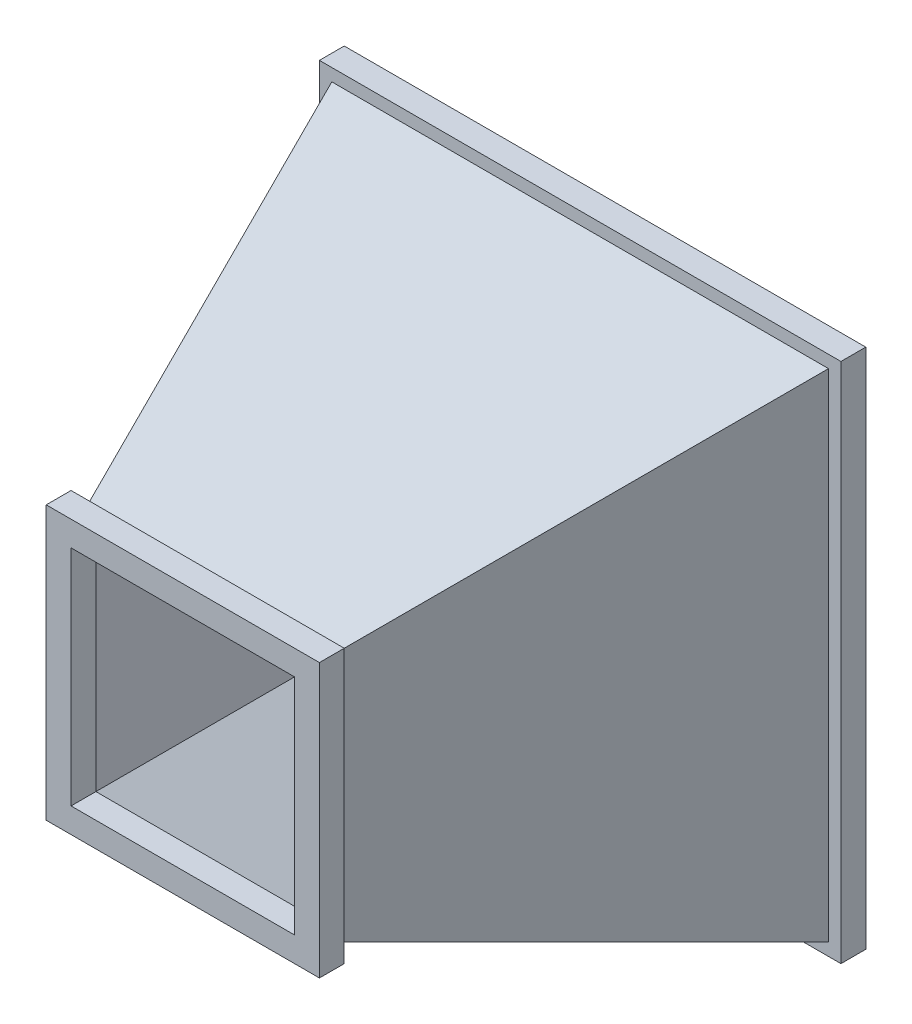
ISO-10303-21;
HEADER;
FILE_DESCRIPTION(('STEP AP214'),'2;1');
FILE_NAME('part.step','',(''),(''),'','','');
FILE_SCHEMA(('AUTOMOTIVE_DESIGN { 1 0 10303 214 1 1 1 1 }'));
ENDSEC;
DATA;
#1=APPLICATION_CONTEXT('core data for automotive mechanical design processes');
#2=APPLICATION_PROTOCOL_DEFINITION('international standard','automotive_design',2000,#1);
#3=PRODUCT_CONTEXT('',#1,'mechanical');
#4=PRODUCT('Part','Part','',(#3));
#5=PRODUCT_RELATED_PRODUCT_CATEGORY('part','',(#4));
#6=PRODUCT_DEFINITION_FORMATION('','',#4);
#7=PRODUCT_DEFINITION_CONTEXT('part definition',#1,'design');
#8=PRODUCT_DEFINITION('design','',#6,#7);
#9=PRODUCT_DEFINITION_SHAPE('','',#8);
#10=(LENGTH_UNIT() NAMED_UNIT(*) SI_UNIT(.MILLI.,.METRE.));
#11=(NAMED_UNIT(*) PLANE_ANGLE_UNIT() SI_UNIT($,.RADIAN.));
#12=(NAMED_UNIT(*) SI_UNIT($,.STERADIAN.) SOLID_ANGLE_UNIT());
#13=UNCERTAINTY_MEASURE_WITH_UNIT(LENGTH_MEASURE(1.E-05),#10,'distance_accuracy_value','');
#14=(GEOMETRIC_REPRESENTATION_CONTEXT(3) GLOBAL_UNCERTAINTY_ASSIGNED_CONTEXT((#13)) GLOBAL_UNIT_ASSIGNED_CONTEXT((#10,
#11,#12)) REPRESENTATION_CONTEXT('',''));
#15=CARTESIAN_POINT('',(0.,0.,0.));
#16=DIRECTION('',(0.,0.,1.));
#17=DIRECTION('',(1.,0.,0.));
#18=AXIS2_PLACEMENT_3D('',#15,#16,#17);
#19=CARTESIAN_POINT('',(228.6,0.,76.1999999999999));
#20=DIRECTION('',(0.948683298050514,0.,0.316227766016838));
#21=DIRECTION('',(0.316227766016838,0.,-0.948683298050514));
#22=AXIS2_PLACEMENT_3D('',#19,#20,#21);
#23=PLANE('',#22);
#24=DIRECTION('',(0.301511344577764,-0.301511344577764,-0.904534033733291));
#25=VECTOR('',#24,1.);
#26=CARTESIAN_POINT('',(127.,-127.,381.));
#27=LINE('',#26,#25);
#28=CARTESIAN_POINT('',(127.,-127.,381.));
#29=VERTEX_POINT('',#28);
#30=CARTESIAN_POINT('',(254.,-254.,0.));
#31=VERTEX_POINT('',#30);
#32=EDGE_CURVE('E364',#29,#31,#27,.T.);
#33=ORIENTED_EDGE('',*,*,#32,.T.);
#34=DIRECTION('',(0.,1.,0.));
#35=VECTOR('',#34,1.);
#36=CARTESIAN_POINT('',(254.,-254.,0.));
#37=LINE('',#36,#35);
#38=CARTESIAN_POINT('',(254.,254.,0.));
#39=VERTEX_POINT('',#38);
#40=EDGE_CURVE('E374',#31,#39,#37,.T.);
#41=ORIENTED_EDGE('',*,*,#40,.T.);
#42=DIRECTION('',(0.301511344577764,0.301511344577764,-0.904534033733291));
#43=VECTOR('',#42,1.);
#44=CARTESIAN_POINT('',(127.,127.,381.));
#45=LINE('',#44,#43);
#46=CARTESIAN_POINT('',(127.,127.,381.));
#47=VERTEX_POINT('',#46);
#48=EDGE_CURVE('E361',#47,#39,#45,.T.);
#49=ORIENTED_EDGE('',*,*,#48,.F.);
#50=DIRECTION('',(0.,1.,0.));
#51=VECTOR('',#50,1.);
#52=CARTESIAN_POINT('',(127.,-127.,381.));
#53=LINE('',#52,#51);
#54=EDGE_CURVE('E391',#29,#47,#53,.T.);
#55=ORIENTED_EDGE('',*,*,#54,.F.);
#56=EDGE_LOOP('',(#33,#41,#49,#55));
#57=FACE_BOUND('',#56,.T.);
#58=ADVANCED_FACE('F57',(#57),#23,.T.);
#59=CARTESIAN_POINT('',(0.,228.6,76.1999999999999));
#60=DIRECTION('',(0.,0.948683298050514,0.316227766016838));
#61=DIRECTION('',(0.,-0.316227766016838,0.948683298050514));
#62=AXIS2_PLACEMENT_3D('',#59,#60,#61);
#63=PLANE('',#62);
#64=ORIENTED_EDGE('',*,*,#48,.T.);
#65=DIRECTION('',(-1.,0.,0.));
#66=VECTOR('',#65,1.);
#67=CARTESIAN_POINT('',(-254.,254.,0.));
#68=LINE('',#67,#66);
#69=CARTESIAN_POINT('',(-254.,254.,0.));
#70=VERTEX_POINT('',#69);
#71=EDGE_CURVE('E481',#39,#70,#68,.T.);
#72=ORIENTED_EDGE('',*,*,#71,.T.);
#73=DIRECTION('',(-0.301511344577764,0.301511344577764,-0.904534033733291));
#74=VECTOR('',#73,1.);
#75=CARTESIAN_POINT('',(-127.,127.,381.));
#76=LINE('',#75,#74);
#77=CARTESIAN_POINT('',(-127.,127.,381.));
#78=VERTEX_POINT('',#77);
#79=EDGE_CURVE('E360',#78,#70,#76,.T.);
#80=ORIENTED_EDGE('',*,*,#79,.F.);
#81=DIRECTION('',(-1.,0.,0.));
#82=VECTOR('',#81,1.);
#83=CARTESIAN_POINT('',(-127.,127.,381.));
#84=LINE('',#83,#82);
#85=EDGE_CURVE('E453',#47,#78,#84,.T.);
#86=ORIENTED_EDGE('',*,*,#85,.F.);
#87=EDGE_LOOP('',(#64,#72,#80,#86));
#88=FACE_BOUND('',#87,.T.);
#89=ADVANCED_FACE('F497',(#88),#63,.T.);
#90=CARTESIAN_POINT('',(0.,-228.6,76.2));
#91=DIRECTION('',(0.,-0.948683298050514,0.316227766016838));
#92=DIRECTION('',(0.,-0.316227766016838,-0.948683298050514));
#93=AXIS2_PLACEMENT_3D('',#90,#91,#92);
#94=PLANE('',#93);
#95=DIRECTION('',(-0.301511344577764,-0.301511344577764,-0.904534033733291));
#96=VECTOR('',#95,1.);
#97=CARTESIAN_POINT('',(-127.,-127.,381.));
#98=LINE('',#97,#96);
#99=CARTESIAN_POINT('',(-127.,-127.,381.));
#100=VERTEX_POINT('',#99);
#101=CARTESIAN_POINT('',(-254.,-254.,0.));
#102=VERTEX_POINT('',#101);
#103=EDGE_CURVE('E356',#100,#102,#98,.T.);
#104=ORIENTED_EDGE('',*,*,#103,.T.);
#105=DIRECTION('',(1.,0.,0.));
#106=VECTOR('',#105,1.);
#107=CARTESIAN_POINT('',(-254.,-254.,0.));
#108=LINE('',#107,#106);
#109=EDGE_CURVE('E12',#102,#31,#108,.T.);
#110=ORIENTED_EDGE('',*,*,#109,.T.);
#111=ORIENTED_EDGE('',*,*,#32,.F.);
#112=DIRECTION('',(1.,0.,0.));
#113=VECTOR('',#112,1.);
#114=CARTESIAN_POINT('',(-127.,-127.,381.));
#115=LINE('',#114,#113);
#116=EDGE_CURVE('E368',#100,#29,#115,.T.);
#117=ORIENTED_EDGE('',*,*,#116,.F.);
#118=EDGE_LOOP('',(#104,#110,#111,#117));
#119=FACE_BOUND('',#118,.T.);
#120=ADVANCED_FACE('F503',(#119),#94,.T.);
#121=CARTESIAN_POINT('',(-228.6,0.,76.2));
#122=DIRECTION('',(-0.948683298050514,0.,0.316227766016838));
#123=DIRECTION('',(0.316227766016838,0.,0.948683298050514));
#124=AXIS2_PLACEMENT_3D('',#121,#122,#123);
#125=PLANE('',#124);
#126=ORIENTED_EDGE('',*,*,#79,.T.);
#127=DIRECTION('',(0.,-1.,0.));
#128=VECTOR('',#127,1.);
#129=CARTESIAN_POINT('',(-254.,-254.,0.));
#130=LINE('',#129,#128);
#131=EDGE_CURVE('E67',#70,#102,#130,.T.);
#132=ORIENTED_EDGE('',*,*,#131,.T.);
#133=ORIENTED_EDGE('',*,*,#103,.F.);
#134=DIRECTION('',(0.,-1.,0.));
#135=VECTOR('',#134,1.);
#136=CARTESIAN_POINT('',(-127.,-127.,381.));
#137=LINE('',#136,#135);
#138=EDGE_CURVE('E447',#78,#100,#137,.T.);
#139=ORIENTED_EDGE('',*,*,#138,.F.);
#140=EDGE_LOOP('',(#126,#132,#133,#139));
#141=FACE_BOUND('',#140,.T.);
#142=ADVANCED_FACE('F59',(#141),#125,.T.);
#143=CARTESIAN_POINT('',(0.,217.17,72.39));
#144=DIRECTION('',(0.,-0.948683298050514,-0.316227766016838));
#145=DIRECTION('',(0.,0.316227766016838,-0.948683298050514));
#146=AXIS2_PLACEMENT_3D('',#143,#144,#145);
#147=PLANE('',#146);
#148=DIRECTION('',(0.301511344577764,-0.301511344577764,0.904534033733291));
#149=VECTOR('',#148,1.);
#150=CARTESIAN_POINT('',(-241.3,241.3,0.));
#151=LINE('',#150,#149);
#152=CARTESIAN_POINT('',(-241.3,241.3,0.));
#153=VERTEX_POINT('',#152);
#154=CARTESIAN_POINT('',(-114.3,114.3,381.));
#155=VERTEX_POINT('',#154);
#156=EDGE_CURVE('E336',#153,#155,#151,.T.);
#157=ORIENTED_EDGE('',*,*,#156,.F.);
#158=DIRECTION('',(1.,0.,0.));
#159=VECTOR('',#158,1.);
#160=CARTESIAN_POINT('',(-241.3,241.3,0.));
#161=LINE('',#160,#159);
#162=CARTESIAN_POINT('',(241.3,241.3,0.));
#163=VERTEX_POINT('',#162);
#164=EDGE_CURVE('E215',#153,#163,#161,.T.);
#165=ORIENTED_EDGE('',*,*,#164,.T.);
#166=DIRECTION('',(-0.301511344577764,-0.301511344577764,0.904534033733291));
#167=VECTOR('',#166,1.);
#168=CARTESIAN_POINT('',(241.3,241.3,0.));
#169=LINE('',#168,#167);
#170=CARTESIAN_POINT('',(114.3,114.3,381.));
#171=VERTEX_POINT('',#170);
#172=EDGE_CURVE('E331',#163,#171,#169,.T.);
#173=ORIENTED_EDGE('',*,*,#172,.T.);
#174=DIRECTION('',(-1.,0.,0.));
#175=VECTOR('',#174,1.);
#176=CARTESIAN_POINT('',(114.3,114.3,381.));
#177=LINE('',#176,#175);
#178=EDGE_CURVE('E392',#171,#155,#177,.T.);
#179=ORIENTED_EDGE('',*,*,#178,.T.);
#180=EDGE_LOOP('',(#157,#165,#173,#179));
#181=FACE_BOUND('',#180,.T.);
#182=ADVANCED_FACE('F507',(#181),#147,.T.);
#183=CARTESIAN_POINT('',(217.17,0.,72.39));
#184=DIRECTION('',(-0.948683298050514,0.,-0.316227766016838));
#185=DIRECTION('',(-0.316227766016838,0.,0.948683298050514));
#186=AXIS2_PLACEMENT_3D('',#183,#184,#185);
#187=PLANE('',#186);
#188=ORIENTED_EDGE('',*,*,#172,.F.);
#189=DIRECTION('',(0.,-1.,0.));
#190=VECTOR('',#189,1.);
#191=CARTESIAN_POINT('',(241.3,241.3,0.));
#192=LINE('',#191,#190);
#193=CARTESIAN_POINT('',(241.3,-241.3,0.));
#194=VERTEX_POINT('',#193);
#195=EDGE_CURVE('E348',#163,#194,#192,.T.);
#196=ORIENTED_EDGE('',*,*,#195,.T.);
#197=DIRECTION('',(-0.301511344577764,0.301511344577764,0.904534033733291));
#198=VECTOR('',#197,1.);
#199=CARTESIAN_POINT('',(241.3,-241.3,0.));
#200=LINE('',#199,#198);
#201=CARTESIAN_POINT('',(114.3,-114.3,381.));
#202=VERTEX_POINT('',#201);
#203=EDGE_CURVE('E339',#194,#202,#200,.T.);
#204=ORIENTED_EDGE('',*,*,#203,.T.);
#205=DIRECTION('',(0.,1.,0.));
#206=VECTOR('',#205,1.);
#207=CARTESIAN_POINT('',(114.3,-114.3,381.));
#208=LINE('',#207,#206);
#209=EDGE_CURVE('E384',#202,#171,#208,.T.);
#210=ORIENTED_EDGE('',*,*,#209,.T.);
#211=EDGE_LOOP('',(#188,#196,#204,#210));
#212=FACE_BOUND('',#211,.T.);
#213=ADVANCED_FACE('F512',(#212),#187,.T.);
#214=CARTESIAN_POINT('',(-217.17,0.,72.3900000000001));
#215=DIRECTION('',(0.948683298050514,0.,-0.316227766016838));
#216=DIRECTION('',(-0.316227766016838,0.,-0.948683298050514));
#217=AXIS2_PLACEMENT_3D('',#214,#215,#216);
#218=PLANE('',#217);
#219=DIRECTION('',(0.301511344577764,0.301511344577764,0.904534033733291));
#220=VECTOR('',#219,1.);
#221=CARTESIAN_POINT('',(-241.3,-241.3,0.));
#222=LINE('',#221,#220);
#223=CARTESIAN_POINT('',(-241.3,-241.3,0.));
#224=VERTEX_POINT('',#223);
#225=CARTESIAN_POINT('',(-114.3,-114.3,381.));
#226=VERTEX_POINT('',#225);
#227=EDGE_CURVE('E335',#224,#226,#222,.T.);
#228=ORIENTED_EDGE('',*,*,#227,.F.);
#229=DIRECTION('',(0.,1.,0.));
#230=VECTOR('',#229,1.);
#231=CARTESIAN_POINT('',(-241.3,-241.3,0.));
#232=LINE('',#231,#230);
#233=EDGE_CURVE('E408',#224,#153,#232,.T.);
#234=ORIENTED_EDGE('',*,*,#233,.T.);
#235=ORIENTED_EDGE('',*,*,#156,.T.);
#236=DIRECTION('',(0.,-1.,0.));
#237=VECTOR('',#236,1.);
#238=CARTESIAN_POINT('',(-114.3,114.3,381.));
#239=LINE('',#238,#237);
#240=EDGE_CURVE('E387',#155,#226,#239,.T.);
#241=ORIENTED_EDGE('',*,*,#240,.T.);
#242=EDGE_LOOP('',(#228,#234,#235,#241));
#243=FACE_BOUND('',#242,.T.);
#244=ADVANCED_FACE('F525',(#243),#218,.T.);
#245=CARTESIAN_POINT('',(0.,-217.17,72.39));
#246=DIRECTION('',(0.,0.948683298050514,-0.316227766016838));
#247=DIRECTION('',(0.,0.316227766016838,0.948683298050514));
#248=AXIS2_PLACEMENT_3D('',#245,#246,#247);
#249=PLANE('',#248);
#250=ORIENTED_EDGE('',*,*,#203,.F.);
#251=DIRECTION('',(-1.,0.,0.));
#252=VECTOR('',#251,1.);
#253=CARTESIAN_POINT('',(241.3,-241.3,0.));
#254=LINE('',#253,#252);
#255=EDGE_CURVE('E330',#194,#224,#254,.T.);
#256=ORIENTED_EDGE('',*,*,#255,.T.);
#257=ORIENTED_EDGE('',*,*,#227,.T.);
#258=DIRECTION('',(1.,0.,0.));
#259=VECTOR('',#258,1.);
#260=CARTESIAN_POINT('',(-114.3,-114.3,381.));
#261=LINE('',#260,#259);
#262=EDGE_CURVE('E75',#226,#202,#261,.T.);
#263=ORIENTED_EDGE('',*,*,#262,.T.);
#264=EDGE_LOOP('',(#250,#256,#257,#263));
#265=FACE_BOUND('',#264,.T.);
#266=ADVANCED_FACE('F522',(#265),#249,.T.);
#267=CARTESIAN_POINT('',(0.,0.,381.));
#268=DIRECTION('',(0.,0.,1.));
#269=DIRECTION('',(1.,0.,0.));
#270=AXIS2_PLACEMENT_3D('',#267,#268,#269);
#271=PLANE('',#270);
#272=DIRECTION('',(1.,0.,0.));
#273=VECTOR('',#272,1.);
#274=CARTESIAN_POINT('',(-139.7,-139.7,381.));
#275=LINE('',#274,#273);
#276=CARTESIAN_POINT('',(-139.7,-139.7,381.));
#277=VERTEX_POINT('',#276);
#278=CARTESIAN_POINT('',(139.7,-139.7,381.));
#279=VERTEX_POINT('',#278);
#280=EDGE_CURVE('E302',#277,#279,#275,.T.);
#281=ORIENTED_EDGE('',*,*,#280,.F.);
#282=DIRECTION('',(0.,-1.,0.));
#283=VECTOR('',#282,1.);
#284=CARTESIAN_POINT('',(-139.7,139.7,381.));
#285=LINE('',#284,#283);
#286=CARTESIAN_POINT('',(-139.7,139.7,381.));
#287=VERTEX_POINT('',#286);
#288=EDGE_CURVE('E292',#287,#277,#285,.T.);
#289=ORIENTED_EDGE('',*,*,#288,.F.);
#290=DIRECTION('',(-1.,0.,0.));
#291=VECTOR('',#290,1.);
#292=CARTESIAN_POINT('',(139.7,139.7,381.));
#293=LINE('',#292,#291);
#294=CARTESIAN_POINT('',(139.7,139.7,381.));
#295=VERTEX_POINT('',#294);
#296=EDGE_CURVE('E310',#295,#287,#293,.T.);
#297=ORIENTED_EDGE('',*,*,#296,.F.);
#298=DIRECTION('',(0.,1.,0.));
#299=VECTOR('',#298,1.);
#300=CARTESIAN_POINT('',(139.7,-139.7,381.));
#301=LINE('',#300,#299);
#302=EDGE_CURVE('E306',#279,#295,#301,.T.);
#303=ORIENTED_EDGE('',*,*,#302,.F.);
#304=EDGE_LOOP('',(#281,#289,#297,#303));
#305=FACE_BOUND('',#304,.T.);
#306=ORIENTED_EDGE('',*,*,#116,.T.);
#307=ORIENTED_EDGE('',*,*,#54,.T.);
#308=ORIENTED_EDGE('',*,*,#85,.T.);
#309=ORIENTED_EDGE('',*,*,#138,.T.);
#310=EDGE_LOOP('',(#306,#307,#308,#309));
#311=FACE_BOUND('',#310,.T.);
#312=ADVANCED_FACE('F500',(#305,#311),#271,.F.);
#313=CARTESIAN_POINT('',(0.,0.,406.4));
#314=DIRECTION('',(0.,0.,1.));
#315=DIRECTION('',(1.,0.,0.));
#316=AXIS2_PLACEMENT_3D('',#313,#314,#315);
#317=PLANE('',#316);
#318=DIRECTION('',(1.,0.,0.));
#319=VECTOR('',#318,1.);
#320=CARTESIAN_POINT('',(-139.7,-139.7,406.4));
#321=LINE('',#320,#319);
#322=CARTESIAN_POINT('',(-139.7,-139.7,406.4));
#323=VERTEX_POINT('',#322);
#324=CARTESIAN_POINT('',(139.7,-139.7,406.4));
#325=VERTEX_POINT('',#324);
#326=EDGE_CURVE('E287',#323,#325,#321,.T.);
#327=ORIENTED_EDGE('',*,*,#326,.T.);
#328=DIRECTION('',(0.,1.,0.));
#329=VECTOR('',#328,1.);
#330=CARTESIAN_POINT('',(139.7,-139.7,406.4));
#331=LINE('',#330,#329);
#332=CARTESIAN_POINT('',(139.7,139.7,406.4));
#333=VERTEX_POINT('',#332);
#334=EDGE_CURVE('E291',#325,#333,#331,.T.);
#335=ORIENTED_EDGE('',*,*,#334,.T.);
#336=DIRECTION('',(-1.,0.,0.));
#337=VECTOR('',#336,1.);
#338=CARTESIAN_POINT('',(139.7,139.7,406.4));
#339=LINE('',#338,#337);
#340=CARTESIAN_POINT('',(-139.7,139.7,406.4));
#341=VERTEX_POINT('',#340);
#342=EDGE_CURVE('E295',#333,#341,#339,.T.);
#343=ORIENTED_EDGE('',*,*,#342,.T.);
#344=DIRECTION('',(0.,-1.,0.));
#345=VECTOR('',#344,1.);
#346=CARTESIAN_POINT('',(-139.7,139.7,406.4));
#347=LINE('',#346,#345);
#348=EDGE_CURVE('E298',#341,#323,#347,.T.);
#349=ORIENTED_EDGE('',*,*,#348,.T.);
#350=EDGE_LOOP('',(#327,#335,#343,#349));
#351=FACE_BOUND('',#350,.T.);
#352=DIRECTION('',(-1.,0.,0.));
#353=VECTOR('',#352,1.);
#354=CARTESIAN_POINT('',(-114.3,114.3,406.4));
#355=LINE('',#354,#353);
#356=CARTESIAN_POINT('',(114.3,114.3,406.4));
#357=VERTEX_POINT('',#356);
#358=CARTESIAN_POINT('',(-114.3,114.3,406.4));
#359=VERTEX_POINT('',#358);
#360=EDGE_CURVE('E276',#357,#359,#355,.T.);
#361=ORIENTED_EDGE('',*,*,#360,.F.);
#362=DIRECTION('',(0.,1.,0.));
#363=VECTOR('',#362,1.);
#364=CARTESIAN_POINT('',(114.3,-114.3,406.4));
#365=LINE('',#364,#363);
#366=CARTESIAN_POINT('',(114.3,-114.3,406.4));
#367=VERTEX_POINT('',#366);
#368=EDGE_CURVE('E273',#367,#357,#365,.T.);
#369=ORIENTED_EDGE('',*,*,#368,.F.);
#370=DIRECTION('',(1.,0.,0.));
#371=VECTOR('',#370,1.);
#372=CARTESIAN_POINT('',(-114.3,-114.3,406.4));
#373=LINE('',#372,#371);
#374=CARTESIAN_POINT('',(-114.3,-114.3,406.4));
#375=VERTEX_POINT('',#374);
#376=EDGE_CURVE('E283',#375,#367,#373,.T.);
#377=ORIENTED_EDGE('',*,*,#376,.F.);
#378=DIRECTION('',(0.,-1.,0.));
#379=VECTOR('',#378,1.);
#380=CARTESIAN_POINT('',(-114.3,-114.3,406.4));
#381=LINE('',#380,#379);
#382=EDGE_CURVE('E279',#359,#375,#381,.T.);
#383=ORIENTED_EDGE('',*,*,#382,.F.);
#384=EDGE_LOOP('',(#361,#369,#377,#383));
#385=FACE_BOUND('',#384,.T.);
#386=ADVANCED_FACE('F537',(#351,#385),#317,.T.);
#387=CARTESIAN_POINT('',(-139.7,-139.7,406.4));
#388=DIRECTION('',(0.,1.,0.));
#389=DIRECTION('',(0.,0.,1.));
#390=AXIS2_PLACEMENT_3D('',#387,#388,#389);
#391=PLANE('',#390);
#392=ORIENTED_EDGE('',*,*,#280,.T.);
#393=DIRECTION('',(0.,0.,-1.));
#394=VECTOR('',#393,1.);
#395=CARTESIAN_POINT('',(139.7,-139.7,406.4));
#396=LINE('',#395,#394);
#397=EDGE_CURVE('E326',#325,#279,#396,.T.);
#398=ORIENTED_EDGE('',*,*,#397,.F.);
#399=ORIENTED_EDGE('',*,*,#326,.F.);
#400=DIRECTION('',(0.,0.,-1.));
#401=VECTOR('',#400,1.);
#402=CARTESIAN_POINT('',(-139.7,-139.7,406.4));
#403=LINE('',#402,#401);
#404=EDGE_CURVE('E301',#323,#277,#403,.T.);
#405=ORIENTED_EDGE('',*,*,#404,.T.);
#406=EDGE_LOOP('',(#392,#398,#399,#405));
#407=FACE_BOUND('',#406,.T.);
#408=ADVANCED_FACE('F533',(#407),#391,.F.);
#409=CARTESIAN_POINT('',(139.7,-139.7,406.4));
#410=DIRECTION('',(-1.,0.,0.));
#411=DIRECTION('',(0.,0.,1.));
#412=AXIS2_PLACEMENT_3D('',#409,#410,#411);
#413=PLANE('',#412);
#414=ORIENTED_EDGE('',*,*,#302,.T.);
#415=DIRECTION('',(0.,0.,-1.));
#416=VECTOR('',#415,1.);
#417=CARTESIAN_POINT('',(139.7,139.7,406.4));
#418=LINE('',#417,#416);
#419=EDGE_CURVE('E322',#333,#295,#418,.T.);
#420=ORIENTED_EDGE('',*,*,#419,.F.);
#421=ORIENTED_EDGE('',*,*,#334,.F.);
#422=ORIENTED_EDGE('',*,*,#397,.T.);
#423=EDGE_LOOP('',(#414,#420,#421,#422));
#424=FACE_BOUND('',#423,.T.);
#425=ADVANCED_FACE('F536',(#424),#413,.F.);
#426=CARTESIAN_POINT('',(139.7,139.7,406.4));
#427=DIRECTION('',(0.,-1.,0.));
#428=DIRECTION('',(0.,0.,-1.));
#429=AXIS2_PLACEMENT_3D('',#426,#427,#428);
#430=PLANE('',#429);
#431=ORIENTED_EDGE('',*,*,#296,.T.);
#432=DIRECTION('',(0.,0.,-1.));
#433=VECTOR('',#432,1.);
#434=CARTESIAN_POINT('',(-139.7,139.7,406.4));
#435=LINE('',#434,#433);
#436=EDGE_CURVE('E318',#341,#287,#435,.T.);
#437=ORIENTED_EDGE('',*,*,#436,.F.);
#438=ORIENTED_EDGE('',*,*,#342,.F.);
#439=ORIENTED_EDGE('',*,*,#419,.T.);
#440=EDGE_LOOP('',(#431,#437,#438,#439));
#441=FACE_BOUND('',#440,.T.);
#442=ADVANCED_FACE('F541',(#441),#430,.F.);
#443=CARTESIAN_POINT('',(-139.7,139.7,406.4));
#444=DIRECTION('',(1.,0.,0.));
#445=DIRECTION('',(0.,1.,0.));
#446=AXIS2_PLACEMENT_3D('',#443,#444,#445);
#447=PLANE('',#446);
#448=ORIENTED_EDGE('',*,*,#288,.T.);
#449=ORIENTED_EDGE('',*,*,#404,.F.);
#450=ORIENTED_EDGE('',*,*,#348,.F.);
#451=ORIENTED_EDGE('',*,*,#436,.T.);
#452=EDGE_LOOP('',(#448,#449,#450,#451));
#453=FACE_BOUND('',#452,.T.);
#454=ADVANCED_FACE('F545',(#453),#447,.F.);
#455=CARTESIAN_POINT('',(114.3,-114.3,406.4));
#456=DIRECTION('',(-1.,0.,0.));
#457=DIRECTION('',(0.,0.,1.));
#458=AXIS2_PLACEMENT_3D('',#455,#456,#457);
#459=PLANE('',#458);
#460=ORIENTED_EDGE('',*,*,#209,.F.);
#461=DIRECTION('',(0.,0.,-1.));
#462=VECTOR('',#461,1.);
#463=CARTESIAN_POINT('',(114.3,-114.3,406.4));
#464=LINE('',#463,#462);
#465=EDGE_CURVE('E286',#367,#202,#464,.T.);
#466=ORIENTED_EDGE('',*,*,#465,.F.);
#467=ORIENTED_EDGE('',*,*,#368,.T.);
#468=DIRECTION('',(0.,0.,-1.));
#469=VECTOR('',#468,1.);
#470=CARTESIAN_POINT('',(114.3,114.3,406.4));
#471=LINE('',#470,#469);
#472=EDGE_CURVE('E307',#357,#171,#471,.T.);
#473=ORIENTED_EDGE('',*,*,#472,.T.);
#474=EDGE_LOOP('',(#460,#466,#467,#473));
#475=FACE_BOUND('',#474,.T.);
#476=ADVANCED_FACE('F549',(#475),#459,.T.);
#477=CARTESIAN_POINT('',(-114.3,114.3,406.4));
#478=DIRECTION('',(0.,-1.,0.));
#479=DIRECTION('',(0.,0.,-1.));
#480=AXIS2_PLACEMENT_3D('',#477,#478,#479);
#481=PLANE('',#480);
#482=ORIENTED_EDGE('',*,*,#178,.F.);
#483=ORIENTED_EDGE('',*,*,#472,.F.);
#484=ORIENTED_EDGE('',*,*,#360,.T.);
#485=DIRECTION('',(0.,0.,-1.));
#486=VECTOR('',#485,1.);
#487=CARTESIAN_POINT('',(-114.3,114.3,406.4));
#488=LINE('',#487,#486);
#489=EDGE_CURVE('E428',#359,#155,#488,.T.);
#490=ORIENTED_EDGE('',*,*,#489,.T.);
#491=EDGE_LOOP('',(#482,#483,#484,#490));
#492=FACE_BOUND('',#491,.T.);
#493=ADVANCED_FACE('F559',(#492),#481,.T.);
#494=CARTESIAN_POINT('',(-114.3,-114.3,406.4));
#495=DIRECTION('',(1.,0.,0.));
#496=DIRECTION('',(0.,0.,-1.));
#497=AXIS2_PLACEMENT_3D('',#494,#495,#496);
#498=PLANE('',#497);
#499=ORIENTED_EDGE('',*,*,#240,.F.);
#500=ORIENTED_EDGE('',*,*,#489,.F.);
#501=ORIENTED_EDGE('',*,*,#382,.T.);
#502=DIRECTION('',(0.,0.,-1.));
#503=VECTOR('',#502,1.);
#504=CARTESIAN_POINT('',(-114.3,-114.3,406.4));
#505=LINE('',#504,#503);
#506=EDGE_CURVE('E425',#375,#226,#505,.T.);
#507=ORIENTED_EDGE('',*,*,#506,.T.);
#508=EDGE_LOOP('',(#499,#500,#501,#507));
#509=FACE_BOUND('',#508,.T.);
#510=ADVANCED_FACE('F563',(#509),#498,.T.);
#511=CARTESIAN_POINT('',(-114.3,-114.3,406.4));
#512=DIRECTION('',(0.,1.,0.));
#513=DIRECTION('',(0.,0.,1.));
#514=AXIS2_PLACEMENT_3D('',#511,#512,#513);
#515=PLANE('',#514);
#516=ORIENTED_EDGE('',*,*,#262,.F.);
#517=ORIENTED_EDGE('',*,*,#506,.F.);
#518=ORIENTED_EDGE('',*,*,#376,.T.);
#519=ORIENTED_EDGE('',*,*,#465,.T.);
#520=EDGE_LOOP('',(#516,#517,#518,#519));
#521=FACE_BOUND('',#520,.T.);
#522=ADVANCED_FACE('F567',(#521),#515,.T.);
#523=CARTESIAN_POINT('',(0.,0.,0.));
#524=DIRECTION('',(0.,0.,-1.));
#525=DIRECTION('',(-1.,0.,0.));
#526=AXIS2_PLACEMENT_3D('',#523,#524,#525);
#527=PLANE('',#526);
#528=DIRECTION('',(-1.,0.,0.));
#529=VECTOR('',#528,1.);
#530=CARTESIAN_POINT('',(266.7,-266.7,0.));
#531=LINE('',#530,#529);
#532=CARTESIAN_POINT('',(266.7,-266.7,0.));
#533=VERTEX_POINT('',#532);
#534=CARTESIAN_POINT('',(-266.7,-266.7,0.));
#535=VERTEX_POINT('',#534);
#536=EDGE_CURVE('E217',#533,#535,#531,.T.);
#537=ORIENTED_EDGE('',*,*,#536,.F.);
#538=DIRECTION('',(0.,-1.,0.));
#539=VECTOR('',#538,1.);
#540=CARTESIAN_POINT('',(266.7,266.7,0.));
#541=LINE('',#540,#539);
#542=CARTESIAN_POINT('',(266.7,266.7,0.));
#543=VERTEX_POINT('',#542);
#544=EDGE_CURVE('E237',#543,#533,#541,.T.);
#545=ORIENTED_EDGE('',*,*,#544,.F.);
#546=DIRECTION('',(1.,0.,0.));
#547=VECTOR('',#546,1.);
#548=CARTESIAN_POINT('',(-266.7,266.7,0.));
#549=LINE('',#548,#547);
#550=CARTESIAN_POINT('',(-266.7,266.7,0.));
#551=VERTEX_POINT('',#550);
#552=EDGE_CURVE('E253',#551,#543,#549,.T.);
#553=ORIENTED_EDGE('',*,*,#552,.F.);
#554=DIRECTION('',(0.,1.,0.));
#555=VECTOR('',#554,1.);
#556=CARTESIAN_POINT('',(-266.7,-266.7,0.));
#557=LINE('',#556,#555);
#558=EDGE_CURVE('E250',#535,#551,#557,.T.);
#559=ORIENTED_EDGE('',*,*,#558,.F.);
#560=EDGE_LOOP('',(#537,#545,#553,#559));
#561=FACE_BOUND('',#560,.T.);
#562=ORIENTED_EDGE('',*,*,#71,.F.);
#563=ORIENTED_EDGE('',*,*,#40,.F.);
#564=ORIENTED_EDGE('',*,*,#109,.F.);
#565=ORIENTED_EDGE('',*,*,#131,.F.);
#566=EDGE_LOOP('',(#562,#563,#564,#565));
#567=FACE_BOUND('',#566,.T.);
#568=ADVANCED_FACE('F504',(#561,#567),#527,.F.);
#569=CARTESIAN_POINT('',(0.,0.,-25.4));
#570=DIRECTION('',(0.,0.,-1.));
#571=DIRECTION('',(-1.,0.,0.));
#572=AXIS2_PLACEMENT_3D('',#569,#570,#571);
#573=PLANE('',#572);
#574=DIRECTION('',(-1.,0.,0.));
#575=VECTOR('',#574,1.);
#576=CARTESIAN_POINT('',(266.7,-266.7,-25.4));
#577=LINE('',#576,#575);
#578=CARTESIAN_POINT('',(266.7,-266.7,-25.4));
#579=VERTEX_POINT('',#578);
#580=CARTESIAN_POINT('',(-266.7,-266.7,-25.4));
#581=VERTEX_POINT('',#580);
#582=EDGE_CURVE('E232',#579,#581,#577,.T.);
#583=ORIENTED_EDGE('',*,*,#582,.T.);
#584=DIRECTION('',(0.,1.,0.));
#585=VECTOR('',#584,1.);
#586=CARTESIAN_POINT('',(-266.7,-266.7,-25.4));
#587=LINE('',#586,#585);
#588=CARTESIAN_POINT('',(-266.7,266.7,-25.4));
#589=VERTEX_POINT('',#588);
#590=EDGE_CURVE('E236',#581,#589,#587,.T.);
#591=ORIENTED_EDGE('',*,*,#590,.T.);
#592=DIRECTION('',(1.,0.,0.));
#593=VECTOR('',#592,1.);
#594=CARTESIAN_POINT('',(-266.7,266.7,-25.4));
#595=LINE('',#594,#593);
#596=CARTESIAN_POINT('',(266.7,266.7,-25.4));
#597=VERTEX_POINT('',#596);
#598=EDGE_CURVE('E240',#589,#597,#595,.T.);
#599=ORIENTED_EDGE('',*,*,#598,.T.);
#600=DIRECTION('',(0.,-1.,0.));
#601=VECTOR('',#600,1.);
#602=CARTESIAN_POINT('',(266.7,266.7,-25.4));
#603=LINE('',#602,#601);
#604=EDGE_CURVE('E243',#597,#579,#603,.T.);
#605=ORIENTED_EDGE('',*,*,#604,.T.);
#606=EDGE_LOOP('',(#583,#591,#599,#605));
#607=FACE_BOUND('',#606,.T.);
#608=DIRECTION('',(1.,0.,0.));
#609=VECTOR('',#608,1.);
#610=CARTESIAN_POINT('',(241.3,241.3,-25.4));
#611=LINE('',#610,#609);
#612=CARTESIAN_POINT('',(-241.3,241.3,-25.4));
#613=VERTEX_POINT('',#612);
#614=CARTESIAN_POINT('',(241.3,241.3,-25.4));
#615=VERTEX_POINT('',#614);
#616=EDGE_CURVE('E209',#613,#615,#611,.T.);
#617=ORIENTED_EDGE('',*,*,#616,.F.);
#618=DIRECTION('',(0.,1.,0.));
#619=VECTOR('',#618,1.);
#620=CARTESIAN_POINT('',(-241.3,-241.3,-25.4));
#621=LINE('',#620,#619);
#622=CARTESIAN_POINT('',(-241.3,-241.3,-25.4));
#623=VERTEX_POINT('',#622);
#624=EDGE_CURVE('E198',#623,#613,#621,.T.);
#625=ORIENTED_EDGE('',*,*,#624,.F.);
#626=DIRECTION('',(-1.,0.,0.));
#627=VECTOR('',#626,1.);
#628=CARTESIAN_POINT('',(241.3,-241.3,-25.4));
#629=LINE('',#628,#627);
#630=CARTESIAN_POINT('',(241.3,-241.3,-25.4));
#631=VERTEX_POINT('',#630);
#632=EDGE_CURVE('E227',#631,#623,#629,.T.);
#633=ORIENTED_EDGE('',*,*,#632,.F.);
#634=DIRECTION('',(0.,-1.,0.));
#635=VECTOR('',#634,1.);
#636=CARTESIAN_POINT('',(241.3,-241.3,-25.4));
#637=LINE('',#636,#635);
#638=EDGE_CURVE('E223',#615,#631,#637,.T.);
#639=ORIENTED_EDGE('',*,*,#638,.F.);
#640=EDGE_LOOP('',(#617,#625,#633,#639));
#641=FACE_BOUND('',#640,.T.);
#642=ADVANCED_FACE('F221',(#607,#641),#573,.T.);
#643=CARTESIAN_POINT('',(266.7,-266.7,-25.4));
#644=DIRECTION('',(0.,1.,0.));
#645=DIRECTION('',(0.,0.,1.));
#646=AXIS2_PLACEMENT_3D('',#643,#644,#645);
#647=PLANE('',#646);
#648=ORIENTED_EDGE('',*,*,#536,.T.);
#649=DIRECTION('',(0.,0.,1.));
#650=VECTOR('',#649,1.);
#651=CARTESIAN_POINT('',(-266.7,-266.7,-25.4));
#652=LINE('',#651,#650);
#653=EDGE_CURVE('E269',#581,#535,#652,.T.);
#654=ORIENTED_EDGE('',*,*,#653,.F.);
#655=ORIENTED_EDGE('',*,*,#582,.F.);
#656=DIRECTION('',(0.,0.,1.));
#657=VECTOR('',#656,1.);
#658=CARTESIAN_POINT('',(266.7,-266.7,-25.4));
#659=LINE('',#658,#657);
#660=EDGE_CURVE('E246',#579,#533,#659,.T.);
#661=ORIENTED_EDGE('',*,*,#660,.T.);
#662=EDGE_LOOP('',(#648,#654,#655,#661));
#663=FACE_BOUND('',#662,.T.);
#664=ADVANCED_FACE('F571',(#663),#647,.F.);
#665=CARTESIAN_POINT('',(-266.7,-266.7,-25.4));
#666=DIRECTION('',(1.,0.,0.));
#667=DIRECTION('',(0.,0.,-1.));
#668=AXIS2_PLACEMENT_3D('',#665,#666,#667);
#669=PLANE('',#668);
#670=ORIENTED_EDGE('',*,*,#558,.T.);
#671=DIRECTION('',(0.,0.,1.));
#672=VECTOR('',#671,1.);
#673=CARTESIAN_POINT('',(-266.7,266.7,-25.4));
#674=LINE('',#673,#672);
#675=EDGE_CURVE('E265',#589,#551,#674,.T.);
#676=ORIENTED_EDGE('',*,*,#675,.F.);
#677=ORIENTED_EDGE('',*,*,#590,.F.);
#678=ORIENTED_EDGE('',*,*,#653,.T.);
#679=EDGE_LOOP('',(#670,#676,#677,#678));
#680=FACE_BOUND('',#679,.T.);
#681=ADVANCED_FACE('F574',(#680),#669,.F.);
#682=CARTESIAN_POINT('',(-266.7,266.7,-25.4));
#683=DIRECTION('',(0.,-1.,0.));
#684=DIRECTION('',(0.,0.,-1.));
#685=AXIS2_PLACEMENT_3D('',#682,#683,#684);
#686=PLANE('',#685);
#687=ORIENTED_EDGE('',*,*,#552,.T.);
#688=DIRECTION('',(0.,0.,1.));
#689=VECTOR('',#688,1.);
#690=CARTESIAN_POINT('',(266.7,266.7,-25.4));
#691=LINE('',#690,#689);
#692=EDGE_CURVE('E261',#597,#543,#691,.T.);
#693=ORIENTED_EDGE('',*,*,#692,.F.);
#694=ORIENTED_EDGE('',*,*,#598,.F.);
#695=ORIENTED_EDGE('',*,*,#675,.T.);
#696=EDGE_LOOP('',(#687,#693,#694,#695));
#697=FACE_BOUND('',#696,.T.);
#698=ADVANCED_FACE('F578',(#697),#686,.F.);
#699=CARTESIAN_POINT('',(266.7,266.7,-25.4));
#700=DIRECTION('',(-1.,0.,0.));
#701=DIRECTION('',(0.,0.,1.));
#702=AXIS2_PLACEMENT_3D('',#699,#700,#701);
#703=PLANE('',#702);
#704=ORIENTED_EDGE('',*,*,#544,.T.);
#705=ORIENTED_EDGE('',*,*,#660,.F.);
#706=ORIENTED_EDGE('',*,*,#604,.F.);
#707=ORIENTED_EDGE('',*,*,#692,.T.);
#708=EDGE_LOOP('',(#704,#705,#706,#707));
#709=FACE_BOUND('',#708,.T.);
#710=ADVANCED_FACE('F582',(#709),#703,.F.);
#711=CARTESIAN_POINT('',(-241.3,-241.3,-25.4));
#712=DIRECTION('',(1.,0.,0.));
#713=DIRECTION('',(0.,0.,-1.));
#714=AXIS2_PLACEMENT_3D('',#711,#712,#713);
#715=PLANE('',#714);
#716=ORIENTED_EDGE('',*,*,#233,.F.);
#717=DIRECTION('',(0.,0.,1.));
#718=VECTOR('',#717,1.);
#719=CARTESIAN_POINT('',(-241.3,-241.3,-25.4));
#720=LINE('',#719,#718);
#721=EDGE_CURVE('E204',#623,#224,#720,.T.);
#722=ORIENTED_EDGE('',*,*,#721,.F.);
#723=ORIENTED_EDGE('',*,*,#624,.T.);
#724=DIRECTION('',(0.,0.,1.));
#725=VECTOR('',#724,1.);
#726=CARTESIAN_POINT('',(-241.3,241.3,-25.4));
#727=LINE('',#726,#725);
#728=EDGE_CURVE('E202',#613,#153,#727,.T.);
#729=ORIENTED_EDGE('',*,*,#728,.T.);
#730=EDGE_LOOP('',(#716,#722,#723,#729));
#731=FACE_BOUND('',#730,.T.);
#732=ADVANCED_FACE('F201',(#731),#715,.T.);
#733=CARTESIAN_POINT('',(241.3,241.3,-25.4));
#734=DIRECTION('',(0.,-1.,0.));
#735=DIRECTION('',(0.,0.,-1.));
#736=AXIS2_PLACEMENT_3D('',#733,#734,#735);
#737=PLANE('',#736);
#738=ORIENTED_EDGE('',*,*,#164,.F.);
#739=ORIENTED_EDGE('',*,*,#728,.F.);
#740=ORIENTED_EDGE('',*,*,#616,.T.);
#741=DIRECTION('',(0.,0.,1.));
#742=VECTOR('',#741,1.);
#743=CARTESIAN_POINT('',(241.3,241.3,-25.4));
#744=LINE('',#743,#742);
#745=EDGE_CURVE('E218',#615,#163,#744,.T.);
#746=ORIENTED_EDGE('',*,*,#745,.T.);
#747=EDGE_LOOP('',(#738,#739,#740,#746));
#748=FACE_BOUND('',#747,.T.);
#749=ADVANCED_FACE('F212',(#748),#737,.T.);
#750=CARTESIAN_POINT('',(241.3,-241.3,-25.4));
#751=DIRECTION('',(-1.,0.,0.));
#752=DIRECTION('',(0.,0.,1.));
#753=AXIS2_PLACEMENT_3D('',#750,#751,#752);
#754=PLANE('',#753);
#755=ORIENTED_EDGE('',*,*,#195,.F.);
#756=ORIENTED_EDGE('',*,*,#745,.F.);
#757=ORIENTED_EDGE('',*,*,#638,.T.);
#758=DIRECTION('',(0.,0.,1.));
#759=VECTOR('',#758,1.);
#760=CARTESIAN_POINT('',(241.3,-241.3,-25.4));
#761=LINE('',#760,#759);
#762=EDGE_CURVE('E468',#631,#194,#761,.T.);
#763=ORIENTED_EDGE('',*,*,#762,.T.);
#764=EDGE_LOOP('',(#755,#756,#757,#763));
#765=FACE_BOUND('',#764,.T.);
#766=ADVANCED_FACE('F597',(#765),#754,.T.);
#767=CARTESIAN_POINT('',(241.3,-241.3,-25.4));
#768=DIRECTION('',(0.,1.,0.));
#769=DIRECTION('',(0.,0.,1.));
#770=AXIS2_PLACEMENT_3D('',#767,#768,#769);
#771=PLANE('',#770);
#772=ORIENTED_EDGE('',*,*,#255,.F.);
#773=ORIENTED_EDGE('',*,*,#762,.F.);
#774=ORIENTED_EDGE('',*,*,#632,.T.);
#775=ORIENTED_EDGE('',*,*,#721,.T.);
#776=EDGE_LOOP('',(#772,#773,#774,#775));
#777=FACE_BOUND('',#776,.T.);
#778=ADVANCED_FACE('F600',(#777),#771,.T.);
#779=CLOSED_SHELL('',(#58,#89,#120,#142,#182,#213,#244,#266,#312,#386,#408,#425,#442,#454,#476,
#493,#510,#522,#568,#642,#664,#681,#698,#710,#732,#749,#766,#778));
#780=MANIFOLD_SOLID_BREP('B2',#779);
#781=ADVANCED_BREP_SHAPE_REPRESENTATION('',(#18,#780),#14);
#782=SHAPE_DEFINITION_REPRESENTATION(#9,#781);
ENDSEC;
END-ISO-10303-21;
